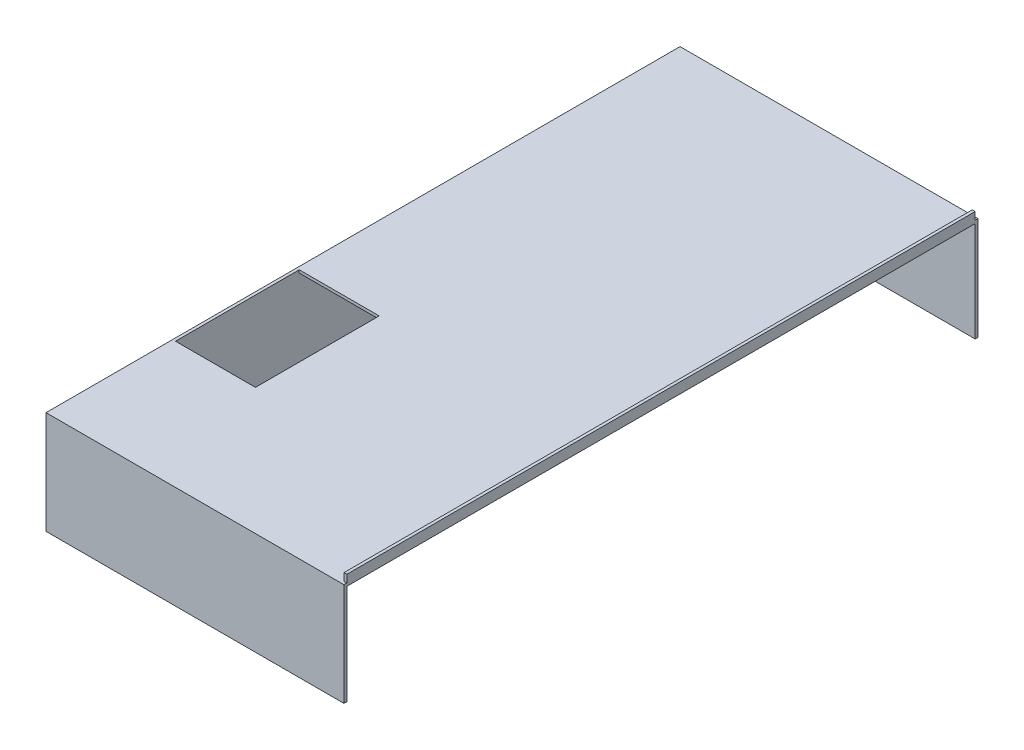
ISO-10303-21;
HEADER;
FILE_DESCRIPTION(('STEP AP214'),'2;1');
FILE_NAME('part.step','',(''),(''),'','','');
FILE_SCHEMA(('AUTOMOTIVE_DESIGN { 1 0 10303 214 1 1 1 1 }'));
ENDSEC;
DATA;
#1=APPLICATION_CONTEXT('core data for automotive mechanical design processes');
#2=APPLICATION_PROTOCOL_DEFINITION('international standard','automotive_design',2000,#1);
#3=PRODUCT_CONTEXT('',#1,'mechanical');
#4=PRODUCT('Part','Part','',(#3));
#5=PRODUCT_RELATED_PRODUCT_CATEGORY('part','',(#4));
#6=PRODUCT_DEFINITION_FORMATION('','',#4);
#7=PRODUCT_DEFINITION_CONTEXT('part definition',#1,'design');
#8=PRODUCT_DEFINITION('design','',#6,#7);
#9=PRODUCT_DEFINITION_SHAPE('','',#8);
#10=(LENGTH_UNIT() NAMED_UNIT(*) SI_UNIT(.MILLI.,.METRE.));
#11=(NAMED_UNIT(*) PLANE_ANGLE_UNIT() SI_UNIT($,.RADIAN.));
#12=(NAMED_UNIT(*) SI_UNIT($,.STERADIAN.) SOLID_ANGLE_UNIT());
#13=UNCERTAINTY_MEASURE_WITH_UNIT(LENGTH_MEASURE(1.E-05),#10,'distance_accuracy_value','');
#14=(GEOMETRIC_REPRESENTATION_CONTEXT(3) GLOBAL_UNCERTAINTY_ASSIGNED_CONTEXT((#13)) GLOBAL_UNIT_ASSIGNED_CONTEXT((#10,
#11,#12)) REPRESENTATION_CONTEXT('',''));
#15=CARTESIAN_POINT('',(0.,0.,0.));
#16=DIRECTION('',(0.,0.,1.));
#17=DIRECTION('',(1.,0.,0.));
#18=AXIS2_PLACEMENT_3D('',#15,#16,#17);
#19=CARTESIAN_POINT('',(189.373653762033,1.5,-330.));
#20=DIRECTION('',(0.,0.,1.));
#21=DIRECTION('',(1.,0.,0.));
#22=AXIS2_PLACEMENT_3D('',#19,#20,#21);
#23=PLANE('',#22);
#24=DIRECTION('',(1.,0.,0.));
#25=VECTOR('',#24,1.);
#26=CARTESIAN_POINT('',(189.373653762033,1.5,-330.));
#27=LINE('',#26,#25);
#28=CARTESIAN_POINT('',(342.873653762033,1.5,-330.));
#29=VERTEX_POINT('',#28);
#30=CARTESIAN_POINT('',(344.373653762033,1.5,-330.));
#31=VERTEX_POINT('',#30);
#32=EDGE_CURVE('E11',#29,#31,#27,.T.);
#33=ORIENTED_EDGE('',*,*,#32,.F.);
#34=DIRECTION('',(0.,-1.,0.));
#35=VECTOR('',#34,1.);
#36=CARTESIAN_POINT('',(342.873653762033,5.5,-330.));
#37=LINE('',#36,#35);
#38=CARTESIAN_POINT('',(342.873653762033,5.5,-330.));
#39=VERTEX_POINT('',#38);
#40=EDGE_CURVE('E216',#39,#29,#37,.T.);
#41=ORIENTED_EDGE('',*,*,#40,.F.);
#42=DIRECTION('',(-1.,0.,0.));
#43=VECTOR('',#42,1.);
#44=CARTESIAN_POINT('',(344.373653762033,5.5,-330.));
#45=LINE('',#44,#43);
#46=CARTESIAN_POINT('',(344.373653762033,5.5,-330.));
#47=VERTEX_POINT('',#46);
#48=EDGE_CURVE('E200',#47,#39,#45,.T.);
#49=ORIENTED_EDGE('',*,*,#48,.F.);
#50=DIRECTION('',(0.,-1.,0.));
#51=VECTOR('',#50,1.);
#52=CARTESIAN_POINT('',(344.373653762033,1.5,-330.));
#53=LINE('',#52,#51);
#54=EDGE_CURVE('E245',#47,#31,#53,.T.);
#55=ORIENTED_EDGE('',*,*,#54,.T.);
#56=EDGE_LOOP('',(#33,#41,#49,#55));
#57=FACE_BOUND('',#56,.T.);
#58=ADVANCED_FACE('F33',(#57),#23,.F.);
#59=CARTESIAN_POINT('',(0.,1.5,0.));
#60=DIRECTION('',(0.,-1.,0.));
#61=DIRECTION('',(0.,0.,-1.));
#62=AXIS2_PLACEMENT_3D('',#59,#60,#61);
#63=PLANE('',#62);
#64=DIRECTION('',(0.,0.,-1.));
#65=VECTOR('',#64,1.);
#66=CARTESIAN_POINT('',(189.373653762033,1.5,-331.5));
#67=LINE('',#66,#65);
#68=CARTESIAN_POINT('',(189.373653762033,1.5,-64.9999999999999));
#69=VERTEX_POINT('',#68);
#70=CARTESIAN_POINT('',(189.373653762033,1.5,-130.));
#71=VERTEX_POINT('',#70);
#72=EDGE_CURVE('E172',#69,#71,#67,.T.);
#73=ORIENTED_EDGE('',*,*,#72,.T.);
#74=DIRECTION('',(1.,0.,0.));
#75=VECTOR('',#74,1.);
#76=CARTESIAN_POINT('',(231.373653762033,1.5,-130.));
#77=LINE('',#76,#75);
#78=CARTESIAN_POINT('',(231.373653762033,1.5,-130.));
#79=VERTEX_POINT('',#78);
#80=EDGE_CURVE('E236',#71,#79,#77,.T.);
#81=ORIENTED_EDGE('',*,*,#80,.T.);
#82=DIRECTION('',(0.,0.,1.));
#83=VECTOR('',#82,1.);
#84=CARTESIAN_POINT('',(231.373653762033,1.5,-65.));
#85=LINE('',#84,#83);
#86=CARTESIAN_POINT('',(231.373653762033,1.5,-65.));
#87=VERTEX_POINT('',#86);
#88=EDGE_CURVE('E238',#79,#87,#85,.T.);
#89=ORIENTED_EDGE('',*,*,#88,.T.);
#90=DIRECTION('',(-1.,0.,0.));
#91=VECTOR('',#90,1.);
#92=CARTESIAN_POINT('',(189.373653762033,1.5,-64.9999999999999));
#93=LINE('',#92,#91);
#94=EDGE_CURVE('E241',#87,#69,#93,.T.);
#95=ORIENTED_EDGE('',*,*,#94,.T.);
#96=EDGE_LOOP('',(#73,#81,#89,#95));
#97=FACE_BOUND('',#96,.T.);
#98=DIRECTION('',(1.,0.,0.));
#99=VECTOR('',#98,1.);
#100=CARTESIAN_POINT('',(344.373653762033,1.5,0.));
#101=LINE('',#100,#99);
#102=CARTESIAN_POINT('',(342.873653762033,1.5,0.));
#103=VERTEX_POINT('',#102);
#104=CARTESIAN_POINT('',(344.373653762033,1.5,0.));
#105=VERTEX_POINT('',#104);
#106=EDGE_CURVE('E201',#103,#105,#101,.T.);
#107=ORIENTED_EDGE('',*,*,#106,.F.);
#108=DIRECTION('',(0.,0.,1.));
#109=VECTOR('',#108,1.);
#110=CARTESIAN_POINT('',(342.873653762033,1.5,0.));
#111=LINE('',#110,#109);
#112=EDGE_CURVE('E196',#29,#103,#111,.T.);
#113=ORIENTED_EDGE('',*,*,#112,.F.);
#114=ORIENTED_EDGE('',*,*,#32,.T.);
#115=DIRECTION('',(0.,0.,1.));
#116=VECTOR('',#115,1.);
#117=CARTESIAN_POINT('',(344.373653762033,1.5,-331.5));
#118=LINE('',#117,#116);
#119=CARTESIAN_POINT('',(344.373653762033,1.5,-331.5));
#120=VERTEX_POINT('',#119);
#121=EDGE_CURVE('E193',#120,#31,#118,.T.);
#122=ORIENTED_EDGE('',*,*,#121,.F.);
#123=DIRECTION('',(1.,0.,0.));
#124=VECTOR('',#123,1.);
#125=CARTESIAN_POINT('',(189.373653762033,1.5,-331.5));
#126=LINE('',#125,#124);
#127=CARTESIAN_POINT('',(187.873653762033,1.5,-331.5));
#128=VERTEX_POINT('',#127);
#129=EDGE_CURVE('E183',#128,#120,#126,.T.);
#130=ORIENTED_EDGE('',*,*,#129,.F.);
#131=DIRECTION('',(0.,0.,-1.));
#132=VECTOR('',#131,1.);
#133=CARTESIAN_POINT('',(187.873653762033,1.5,-331.5));
#134=LINE('',#133,#132);
#135=CARTESIAN_POINT('',(187.873653762033,1.5,1.5));
#136=VERTEX_POINT('',#135);
#137=EDGE_CURVE('E171',#136,#128,#134,.T.);
#138=ORIENTED_EDGE('',*,*,#137,.F.);
#139=DIRECTION('',(-1.,0.,0.));
#140=VECTOR('',#139,1.);
#141=CARTESIAN_POINT('',(189.373653762033,1.5,1.5));
#142=LINE('',#141,#140);
#143=CARTESIAN_POINT('',(344.373653762033,1.5,1.5));
#144=VERTEX_POINT('',#143);
#145=EDGE_CURVE('E225',#144,#136,#142,.T.);
#146=ORIENTED_EDGE('',*,*,#145,.F.);
#147=DIRECTION('',(0.,0.,-1.));
#148=VECTOR('',#147,1.);
#149=CARTESIAN_POINT('',(344.373653762033,1.5,-330.));
#150=LINE('',#149,#148);
#151=EDGE_CURVE('E55',#144,#105,#150,.T.);
#152=ORIENTED_EDGE('',*,*,#151,.T.);
#153=EDGE_LOOP('',(#107,#113,#114,#122,#130,#138,#146,#152));
#154=FACE_BOUND('',#153,.T.);
#155=ADVANCED_FACE('F295',(#97,#154),#63,.F.);
#156=CARTESIAN_POINT('',(231.373653762033,1.5,-130.));
#157=DIRECTION('',(0.,0.,-1.));
#158=DIRECTION('',(-1.,0.,0.));
#159=AXIS2_PLACEMENT_3D('',#156,#157,#158);
#160=PLANE('',#159);
#161=DIRECTION('',(1.,0.,0.));
#162=VECTOR('',#161,1.);
#163=CARTESIAN_POINT('',(231.373653762033,0.,-130.));
#164=LINE('',#163,#162);
#165=CARTESIAN_POINT('',(189.373653762033,0.,-130.));
#166=VERTEX_POINT('',#165);
#167=CARTESIAN_POINT('',(231.373653762033,0.,-130.));
#168=VERTEX_POINT('',#167);
#169=EDGE_CURVE('E248',#166,#168,#164,.T.);
#170=ORIENTED_EDGE('',*,*,#169,.T.);
#171=DIRECTION('',(0.,-1.,0.));
#172=VECTOR('',#171,1.);
#173=CARTESIAN_POINT('',(231.373653762033,1.5,-130.));
#174=LINE('',#173,#172);
#175=EDGE_CURVE('E268',#79,#168,#174,.T.);
#176=ORIENTED_EDGE('',*,*,#175,.F.);
#177=ORIENTED_EDGE('',*,*,#80,.F.);
#178=DIRECTION('',(0.,-1.,0.));
#179=VECTOR('',#178,1.);
#180=CARTESIAN_POINT('',(189.373653762033,1.5,-130.));
#181=LINE('',#180,#179);
#182=EDGE_CURVE('E37',#71,#166,#181,.T.);
#183=ORIENTED_EDGE('',*,*,#182,.T.);
#184=EDGE_LOOP('',(#170,#176,#177,#183));
#185=FACE_BOUND('',#184,.T.);
#186=ADVANCED_FACE('F35',(#185),#160,.F.);
#187=CARTESIAN_POINT('',(231.373653762033,1.5,-65.));
#188=DIRECTION('',(1.,0.,0.));
#189=DIRECTION('',(0.,0.,-1.));
#190=AXIS2_PLACEMENT_3D('',#187,#188,#189);
#191=PLANE('',#190);
#192=DIRECTION('',(0.,0.,1.));
#193=VECTOR('',#192,1.);
#194=CARTESIAN_POINT('',(231.373653762033,0.,-65.));
#195=LINE('',#194,#193);
#196=CARTESIAN_POINT('',(231.373653762033,0.,-65.));
#197=VERTEX_POINT('',#196);
#198=EDGE_CURVE('E250',#168,#197,#195,.T.);
#199=ORIENTED_EDGE('',*,*,#198,.T.);
#200=DIRECTION('',(0.,-1.,0.));
#201=VECTOR('',#200,1.);
#202=CARTESIAN_POINT('',(231.373653762033,1.5,-65.));
#203=LINE('',#202,#201);
#204=EDGE_CURVE('E266',#87,#197,#203,.T.);
#205=ORIENTED_EDGE('',*,*,#204,.F.);
#206=ORIENTED_EDGE('',*,*,#88,.F.);
#207=ORIENTED_EDGE('',*,*,#175,.T.);
#208=EDGE_LOOP('',(#199,#205,#206,#207));
#209=FACE_BOUND('',#208,.T.);
#210=ADVANCED_FACE('F289',(#209),#191,.F.);
#211=CARTESIAN_POINT('',(189.373653762033,1.5,-64.9999999999999));
#212=DIRECTION('',(0.,0.,1.));
#213=DIRECTION('',(1.,0.,0.));
#214=AXIS2_PLACEMENT_3D('',#211,#212,#213);
#215=PLANE('',#214);
#216=DIRECTION('',(-1.,0.,0.));
#217=VECTOR('',#216,1.);
#218=CARTESIAN_POINT('',(189.373653762033,0.,-64.9999999999999));
#219=LINE('',#218,#217);
#220=CARTESIAN_POINT('',(189.373653762033,0.,-64.9999999999999));
#221=VERTEX_POINT('',#220);
#222=EDGE_CURVE('E252',#197,#221,#219,.T.);
#223=ORIENTED_EDGE('',*,*,#222,.T.);
#224=DIRECTION('',(0.,-1.,0.));
#225=VECTOR('',#224,1.);
#226=CARTESIAN_POINT('',(189.373653762033,1.5,-64.9999999999999));
#227=LINE('',#226,#225);
#228=EDGE_CURVE('E264',#69,#221,#227,.T.);
#229=ORIENTED_EDGE('',*,*,#228,.F.);
#230=ORIENTED_EDGE('',*,*,#94,.F.);
#231=ORIENTED_EDGE('',*,*,#204,.T.);
#232=EDGE_LOOP('',(#223,#229,#230,#231));
#233=FACE_BOUND('',#232,.T.);
#234=ADVANCED_FACE('F292',(#233),#215,.F.);
#235=CARTESIAN_POINT('',(344.373653762033,1.5,-330.));
#236=DIRECTION('',(-1.,0.,0.));
#237=DIRECTION('',(0.,0.,1.));
#238=AXIS2_PLACEMENT_3D('',#235,#236,#237);
#239=PLANE('',#238);
#240=DIRECTION('',(0.,0.,-1.));
#241=VECTOR('',#240,1.);
#242=CARTESIAN_POINT('',(344.373653762033,0.,-330.));
#243=LINE('',#242,#241);
#244=CARTESIAN_POINT('',(344.373653762033,0.,0.));
#245=VERTEX_POINT('',#244);
#246=CARTESIAN_POINT('',(344.373653762033,0.,-330.));
#247=VERTEX_POINT('',#246);
#248=EDGE_CURVE('E260',#245,#247,#243,.T.);
#249=ORIENTED_EDGE('',*,*,#248,.T.);
#250=DIRECTION('',(0.,-1.,0.));
#251=VECTOR('',#250,1.);
#252=CARTESIAN_POINT('',(344.373653762033,1.5,-330.));
#253=LINE('',#252,#251);
#254=CARTESIAN_POINT('',(344.373653762033,-52.5,-330.));
#255=VERTEX_POINT('',#254);
#256=EDGE_CURVE('E188',#247,#255,#253,.T.);
#257=ORIENTED_EDGE('',*,*,#256,.T.);
#258=DIRECTION('',(0.,0.,1.));
#259=VECTOR('',#258,1.);
#260=CARTESIAN_POINT('',(344.373653762033,-52.5,-331.5));
#261=LINE('',#260,#259);
#262=CARTESIAN_POINT('',(344.373653762033,-52.5,-331.5));
#263=VERTEX_POINT('',#262);
#264=EDGE_CURVE('E156',#263,#255,#261,.T.);
#265=ORIENTED_EDGE('',*,*,#264,.F.);
#266=DIRECTION('',(0.,-1.,0.));
#267=VECTOR('',#266,1.);
#268=CARTESIAN_POINT('',(344.373653762033,1.5,-331.5));
#269=LINE('',#268,#267);
#270=EDGE_CURVE('E152',#120,#263,#269,.T.);
#271=ORIENTED_EDGE('',*,*,#270,.F.);
#272=ORIENTED_EDGE('',*,*,#121,.T.);
#273=ORIENTED_EDGE('',*,*,#54,.F.);
#274=DIRECTION('',(0.,0.,-1.));
#275=VECTOR('',#274,1.);
#276=CARTESIAN_POINT('',(344.373653762033,5.5,0.));
#277=LINE('',#276,#275);
#278=CARTESIAN_POINT('',(344.373653762033,5.5,0.));
#279=VERTEX_POINT('',#278);
#280=EDGE_CURVE('E197',#279,#47,#277,.T.);
#281=ORIENTED_EDGE('',*,*,#280,.F.);
#282=DIRECTION('',(0.,-1.,0.));
#283=VECTOR('',#282,1.);
#284=CARTESIAN_POINT('',(344.373653762033,5.5,0.));
#285=LINE('',#284,#283);
#286=EDGE_CURVE('E207',#279,#105,#285,.T.);
#287=ORIENTED_EDGE('',*,*,#286,.T.);
#288=ORIENTED_EDGE('',*,*,#151,.F.);
#289=DIRECTION('',(0.,1.,0.));
#290=VECTOR('',#289,1.);
#291=CARTESIAN_POINT('',(344.373653762033,1.5,1.5));
#292=LINE('',#291,#290);
#293=CARTESIAN_POINT('',(344.373653762033,-52.5,1.5));
#294=VERTEX_POINT('',#293);
#295=EDGE_CURVE('E221',#294,#144,#292,.T.);
#296=ORIENTED_EDGE('',*,*,#295,.F.);
#297=DIRECTION('',(0.,0.,-1.));
#298=VECTOR('',#297,1.);
#299=CARTESIAN_POINT('',(344.373653762033,-52.5,1.5));
#300=LINE('',#299,#298);
#301=CARTESIAN_POINT('',(344.373653762033,-52.5,0.));
#302=VERTEX_POINT('',#301);
#303=EDGE_CURVE('E227',#294,#302,#300,.T.);
#304=ORIENTED_EDGE('',*,*,#303,.T.);
#305=DIRECTION('',(0.,1.,0.));
#306=VECTOR('',#305,1.);
#307=CARTESIAN_POINT('',(344.373653762033,1.5,0.));
#308=LINE('',#307,#306);
#309=EDGE_CURVE('E222',#302,#245,#308,.T.);
#310=ORIENTED_EDGE('',*,*,#309,.T.);
#311=EDGE_LOOP('',(#249,#257,#265,#271,#272,#273,#281,#287,#288,#296,#304,#310));
#312=FACE_BOUND('',#311,.T.);
#313=ADVANCED_FACE('F304',(#312),#239,.F.);
#314=CARTESIAN_POINT('',(0.,0.,0.));
#315=DIRECTION('',(0.,-1.,0.));
#316=DIRECTION('',(0.,0.,-1.));
#317=AXIS2_PLACEMENT_3D('',#314,#315,#316);
#318=PLANE('',#317);
#319=DIRECTION('',(0.,0.,1.));
#320=VECTOR('',#319,1.);
#321=CARTESIAN_POINT('',(189.373653762033,0.,-130.));
#322=LINE('',#321,#320);
#323=CARTESIAN_POINT('',(189.373653762033,0.,-330.));
#324=VERTEX_POINT('',#323);
#325=EDGE_CURVE('E235',#324,#166,#322,.T.);
#326=ORIENTED_EDGE('',*,*,#325,.F.);
#327=DIRECTION('',(-1.,0.,0.));
#328=VECTOR('',#327,1.);
#329=CARTESIAN_POINT('',(189.373653762033,0.,-330.));
#330=LINE('',#329,#328);
#331=EDGE_CURVE('E239',#247,#324,#330,.T.);
#332=ORIENTED_EDGE('',*,*,#331,.F.);
#333=ORIENTED_EDGE('',*,*,#248,.F.);
#334=DIRECTION('',(1.,0.,0.));
#335=VECTOR('',#334,1.);
#336=CARTESIAN_POINT('',(344.373653762033,0.,0.));
#337=LINE('',#336,#335);
#338=CARTESIAN_POINT('',(189.373653762033,0.,0.));
#339=VERTEX_POINT('',#338);
#340=EDGE_CURVE('E257',#339,#245,#337,.T.);
#341=ORIENTED_EDGE('',*,*,#340,.F.);
#342=DIRECTION('',(0.,0.,1.));
#343=VECTOR('',#342,1.);
#344=CARTESIAN_POINT('',(189.373653762033,0.,0.));
#345=LINE('',#344,#343);
#346=EDGE_CURVE('E255',#221,#339,#345,.T.);
#347=ORIENTED_EDGE('',*,*,#346,.F.);
#348=ORIENTED_EDGE('',*,*,#222,.F.);
#349=ORIENTED_EDGE('',*,*,#198,.F.);
#350=ORIENTED_EDGE('',*,*,#169,.F.);
#351=EDGE_LOOP('',(#326,#332,#333,#341,#347,#348,#349,#350));
#352=FACE_BOUND('',#351,.T.);
#353=ADVANCED_FACE('F284',(#352),#318,.T.);
#354=CARTESIAN_POINT('',(0.,0.,0.));
#355=DIRECTION('',(0.,0.,1.));
#356=DIRECTION('',(1.,0.,0.));
#357=AXIS2_PLACEMENT_3D('',#354,#355,#356);
#358=PLANE('',#357);
#359=DIRECTION('',(0.,-1.,0.));
#360=VECTOR('',#359,1.);
#361=CARTESIAN_POINT('',(189.373653762033,1.5,0.));
#362=LINE('',#361,#360);
#363=CARTESIAN_POINT('',(189.373653762033,-52.5,0.));
#364=VERTEX_POINT('',#363);
#365=EDGE_CURVE('E219',#339,#364,#362,.T.);
#366=ORIENTED_EDGE('',*,*,#365,.F.);
#367=ORIENTED_EDGE('',*,*,#340,.T.);
#368=ORIENTED_EDGE('',*,*,#309,.F.);
#369=DIRECTION('',(1.,0.,0.));
#370=VECTOR('',#369,1.);
#371=CARTESIAN_POINT('',(189.373653762033,-52.5,0.));
#372=LINE('',#371,#370);
#373=EDGE_CURVE('E229',#364,#302,#372,.T.);
#374=ORIENTED_EDGE('',*,*,#373,.F.);
#375=EDGE_LOOP('',(#366,#367,#368,#374));
#376=FACE_BOUND('',#375,.T.);
#377=ADVANCED_FACE('F301',(#376),#358,.F.);
#378=CARTESIAN_POINT('',(189.373653762033,-52.5,1.5));
#379=DIRECTION('',(0.,1.,0.));
#380=DIRECTION('',(0.,0.,1.));
#381=AXIS2_PLACEMENT_3D('',#378,#379,#380);
#382=PLANE('',#381);
#383=ORIENTED_EDGE('',*,*,#373,.T.);
#384=ORIENTED_EDGE('',*,*,#303,.F.);
#385=DIRECTION('',(1.,0.,0.));
#386=VECTOR('',#385,1.);
#387=CARTESIAN_POINT('',(189.373653762033,-52.5,1.5));
#388=LINE('',#387,#386);
#389=CARTESIAN_POINT('',(187.873653762033,-52.5,1.5));
#390=VERTEX_POINT('',#389);
#391=EDGE_CURVE('E162',#390,#294,#388,.T.);
#392=ORIENTED_EDGE('',*,*,#391,.F.);
#393=DIRECTION('',(0.,0.,1.));
#394=VECTOR('',#393,1.);
#395=CARTESIAN_POINT('',(187.873653762033,-52.5,-331.5));
#396=LINE('',#395,#394);
#397=CARTESIAN_POINT('',(187.873653762033,-52.5,-331.5));
#398=VERTEX_POINT('',#397);
#399=EDGE_CURVE('E159',#398,#390,#396,.T.);
#400=ORIENTED_EDGE('',*,*,#399,.F.);
#401=DIRECTION('',(-1.,0.,0.));
#402=VECTOR('',#401,1.);
#403=CARTESIAN_POINT('',(189.373653762033,-52.5,-331.5));
#404=LINE('',#403,#402);
#405=EDGE_CURVE('E146',#263,#398,#404,.T.);
#406=ORIENTED_EDGE('',*,*,#405,.F.);
#407=ORIENTED_EDGE('',*,*,#264,.T.);
#408=DIRECTION('',(-1.,0.,0.));
#409=VECTOR('',#408,1.);
#410=CARTESIAN_POINT('',(189.373653762033,-52.5,-330.));
#411=LINE('',#410,#409);
#412=CARTESIAN_POINT('',(189.373653762033,-52.5,-330.));
#413=VERTEX_POINT('',#412);
#414=EDGE_CURVE('E185',#255,#413,#411,.T.);
#415=ORIENTED_EDGE('',*,*,#414,.T.);
#416=DIRECTION('',(0.,0.,1.));
#417=VECTOR('',#416,1.);
#418=CARTESIAN_POINT('',(189.373653762033,-52.5,-331.5));
#419=LINE('',#418,#417);
#420=EDGE_CURVE('E175',#413,#364,#419,.T.);
#421=ORIENTED_EDGE('',*,*,#420,.T.);
#422=EDGE_LOOP('',(#383,#384,#392,#400,#406,#407,#415,#421));
#423=FACE_BOUND('',#422,.T.);
#424=ADVANCED_FACE('F160',(#423),#382,.F.);
#425=CARTESIAN_POINT('',(0.,0.,1.5));
#426=DIRECTION('',(0.,0.,1.));
#427=DIRECTION('',(1.,0.,0.));
#428=AXIS2_PLACEMENT_3D('',#425,#426,#427);
#429=PLANE('',#428);
#430=ORIENTED_EDGE('',*,*,#145,.T.);
#431=DIRECTION('',(0.,1.,0.));
#432=VECTOR('',#431,1.);
#433=CARTESIAN_POINT('',(187.873653762033,1.5,1.5));
#434=LINE('',#433,#432);
#435=EDGE_CURVE('E166',#390,#136,#434,.T.);
#436=ORIENTED_EDGE('',*,*,#435,.F.);
#437=ORIENTED_EDGE('',*,*,#391,.T.);
#438=ORIENTED_EDGE('',*,*,#295,.T.);
#439=EDGE_LOOP('',(#430,#436,#437,#438));
#440=FACE_BOUND('',#439,.T.);
#441=ADVANCED_FACE('F306',(#440),#429,.T.);
#442=CARTESIAN_POINT('',(342.873653762033,5.5,0.));
#443=DIRECTION('',(1.,0.,0.));
#444=DIRECTION('',(0.,0.,-1.));
#445=AXIS2_PLACEMENT_3D('',#442,#443,#444);
#446=PLANE('',#445);
#447=ORIENTED_EDGE('',*,*,#112,.T.);
#448=DIRECTION('',(0.,-1.,0.));
#449=VECTOR('',#448,1.);
#450=CARTESIAN_POINT('',(342.873653762033,5.5,0.));
#451=LINE('',#450,#449);
#452=CARTESIAN_POINT('',(342.873653762033,5.5,0.));
#453=VERTEX_POINT('',#452);
#454=EDGE_CURVE('E213',#453,#103,#451,.T.);
#455=ORIENTED_EDGE('',*,*,#454,.F.);
#456=DIRECTION('',(0.,0.,1.));
#457=VECTOR('',#456,1.);
#458=CARTESIAN_POINT('',(342.873653762033,5.5,0.));
#459=LINE('',#458,#457);
#460=EDGE_CURVE('E203',#39,#453,#459,.T.);
#461=ORIENTED_EDGE('',*,*,#460,.F.);
#462=ORIENTED_EDGE('',*,*,#40,.T.);
#463=EDGE_LOOP('',(#447,#455,#461,#462));
#464=FACE_BOUND('',#463,.T.);
#465=ADVANCED_FACE('F351',(#464),#446,.F.);
#466=CARTESIAN_POINT('',(344.373653762033,5.5,0.));
#467=DIRECTION('',(0.,0.,-1.));
#468=DIRECTION('',(-1.,0.,0.));
#469=AXIS2_PLACEMENT_3D('',#466,#467,#468);
#470=PLANE('',#469);
#471=ORIENTED_EDGE('',*,*,#106,.T.);
#472=ORIENTED_EDGE('',*,*,#286,.F.);
#473=DIRECTION('',(1.,0.,0.));
#474=VECTOR('',#473,1.);
#475=CARTESIAN_POINT('',(344.373653762033,5.5,0.));
#476=LINE('',#475,#474);
#477=EDGE_CURVE('E205',#453,#279,#476,.T.);
#478=ORIENTED_EDGE('',*,*,#477,.F.);
#479=ORIENTED_EDGE('',*,*,#454,.T.);
#480=EDGE_LOOP('',(#471,#472,#478,#479));
#481=FACE_BOUND('',#480,.T.);
#482=ADVANCED_FACE('F356',(#481),#470,.F.);
#483=CARTESIAN_POINT('',(0.,5.5,0.));
#484=DIRECTION('',(0.,1.,0.));
#485=DIRECTION('',(0.,0.,1.));
#486=AXIS2_PLACEMENT_3D('',#483,#484,#485);
#487=PLANE('',#486);
#488=ORIENTED_EDGE('',*,*,#280,.T.);
#489=ORIENTED_EDGE('',*,*,#48,.T.);
#490=ORIENTED_EDGE('',*,*,#460,.T.);
#491=ORIENTED_EDGE('',*,*,#477,.T.);
#492=EDGE_LOOP('',(#488,#489,#490,#491));
#493=FACE_BOUND('',#492,.T.);
#494=ADVANCED_FACE('F318',(#493),#487,.T.);
#495=CARTESIAN_POINT('',(0.,0.,-331.5));
#496=DIRECTION('',(0.,0.,1.));
#497=DIRECTION('',(1.,0.,0.));
#498=AXIS2_PLACEMENT_3D('',#495,#496,#497);
#499=PLANE('',#498);
#500=ORIENTED_EDGE('',*,*,#405,.T.);
#501=DIRECTION('',(0.,-1.,0.));
#502=VECTOR('',#501,1.);
#503=CARTESIAN_POINT('',(187.873653762033,1.5,-331.5));
#504=LINE('',#503,#502);
#505=EDGE_CURVE('E150',#128,#398,#504,.T.);
#506=ORIENTED_EDGE('',*,*,#505,.F.);
#507=ORIENTED_EDGE('',*,*,#129,.T.);
#508=ORIENTED_EDGE('',*,*,#270,.T.);
#509=EDGE_LOOP('',(#500,#506,#507,#508));
#510=FACE_BOUND('',#509,.T.);
#511=ADVANCED_FACE('F148',(#510),#499,.F.);
#512=CARTESIAN_POINT('',(0.,0.,-330.));
#513=DIRECTION('',(0.,0.,1.));
#514=DIRECTION('',(1.,0.,0.));
#515=AXIS2_PLACEMENT_3D('',#512,#513,#514);
#516=PLANE('',#515);
#517=ORIENTED_EDGE('',*,*,#256,.F.);
#518=ORIENTED_EDGE('',*,*,#331,.T.);
#519=DIRECTION('',(0.,1.,0.));
#520=VECTOR('',#519,1.);
#521=CARTESIAN_POINT('',(189.373653762033,1.5,-330.));
#522=LINE('',#521,#520);
#523=EDGE_CURVE('E180',#413,#324,#522,.T.);
#524=ORIENTED_EDGE('',*,*,#523,.F.);
#525=ORIENTED_EDGE('',*,*,#414,.F.);
#526=EDGE_LOOP('',(#517,#518,#524,#525));
#527=FACE_BOUND('',#526,.T.);
#528=ADVANCED_FACE('F310',(#527),#516,.T.);
#529=CARTESIAN_POINT('',(189.373653762033,0.,0.));
#530=DIRECTION('',(-1.,0.,0.));
#531=DIRECTION('',(0.,0.,1.));
#532=AXIS2_PLACEMENT_3D('',#529,#530,#531);
#533=PLANE('',#532);
#534=ORIENTED_EDGE('',*,*,#72,.F.);
#535=ORIENTED_EDGE('',*,*,#228,.T.);
#536=ORIENTED_EDGE('',*,*,#346,.T.);
#537=ORIENTED_EDGE('',*,*,#365,.T.);
#538=ORIENTED_EDGE('',*,*,#420,.F.);
#539=ORIENTED_EDGE('',*,*,#523,.T.);
#540=ORIENTED_EDGE('',*,*,#325,.T.);
#541=ORIENTED_EDGE('',*,*,#182,.F.);
#542=EDGE_LOOP('',(#534,#535,#536,#537,#538,#539,#540,#541));
#543=FACE_BOUND('',#542,.T.);
#544=ADVANCED_FACE('F279',(#543),#533,.F.);
#545=CARTESIAN_POINT('',(187.873653762033,0.,0.));
#546=DIRECTION('',(-1.,0.,0.));
#547=DIRECTION('',(0.,0.,1.));
#548=AXIS2_PLACEMENT_3D('',#545,#546,#547);
#549=PLANE('',#548);
#550=ORIENTED_EDGE('',*,*,#505,.T.);
#551=ORIENTED_EDGE('',*,*,#399,.T.);
#552=ORIENTED_EDGE('',*,*,#435,.T.);
#553=ORIENTED_EDGE('',*,*,#137,.T.);
#554=EDGE_LOOP('',(#550,#551,#552,#553));
#555=FACE_BOUND('',#554,.T.);
#556=ADVANCED_FACE('F169',(#555),#549,.T.);
#557=CLOSED_SHELL('',(#58,#155,#186,#210,#234,#313,#353,#377,#424,#441,#465,#482,#494,#511,#528,
#544,#556));
#558=MANIFOLD_SOLID_BREP('B2',#557);
#559=ADVANCED_BREP_SHAPE_REPRESENTATION('',(#18,#558),#14);
#560=SHAPE_DEFINITION_REPRESENTATION(#9,#559);
ENDSEC;
END-ISO-10303-21;
